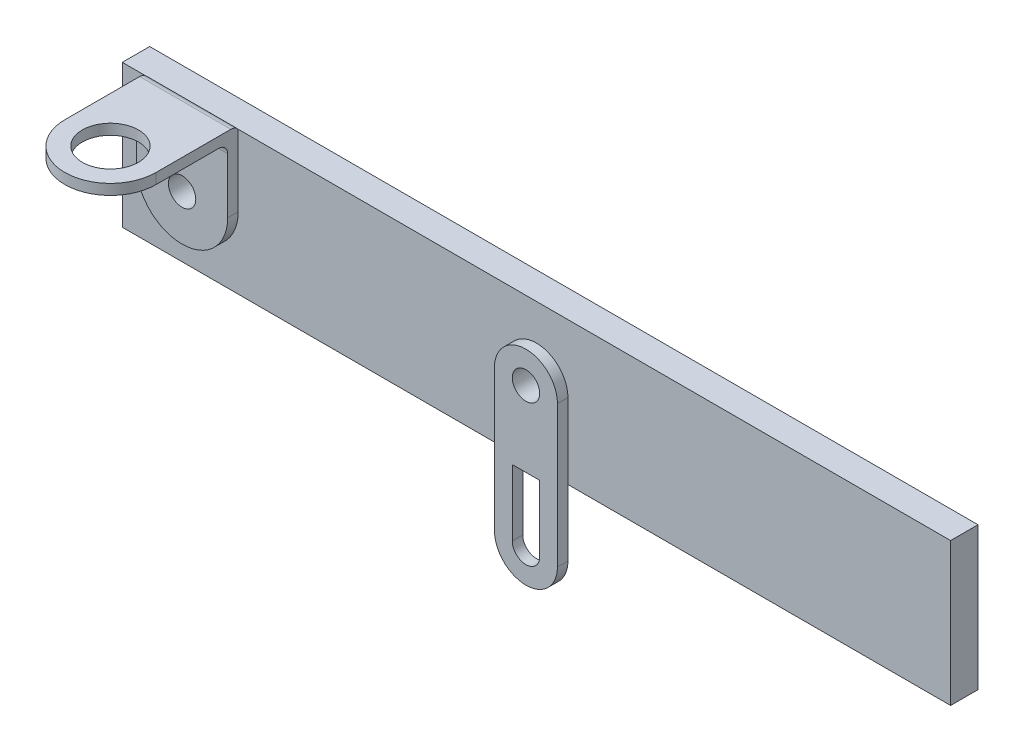
ISO-10303-21;
HEADER;
FILE_DESCRIPTION(('STEP AP214'),'2;1');
FILE_NAME('part.step','',(''),(''),'','','');
FILE_SCHEMA(('AUTOMOTIVE_DESIGN { 1 0 10303 214 1 1 1 1 }'));
ENDSEC;
DATA;
#1=APPLICATION_CONTEXT('core data for automotive mechanical design processes');
#2=APPLICATION_PROTOCOL_DEFINITION('international standard','automotive_design',2000,#1);
#3=PRODUCT_CONTEXT('',#1,'mechanical');
#4=PRODUCT('Part','Part','',(#3));
#5=PRODUCT_RELATED_PRODUCT_CATEGORY('part','',(#4));
#6=PRODUCT_DEFINITION_FORMATION('','',#4);
#7=PRODUCT_DEFINITION_CONTEXT('part definition',#1,'design');
#8=PRODUCT_DEFINITION('design','',#6,#7);
#9=PRODUCT_DEFINITION_SHAPE('','',#8);
#10=(LENGTH_UNIT() NAMED_UNIT(*) SI_UNIT(.MILLI.,.METRE.));
#11=(NAMED_UNIT(*) PLANE_ANGLE_UNIT() SI_UNIT($,.RADIAN.));
#12=(NAMED_UNIT(*) SI_UNIT($,.STERADIAN.) SOLID_ANGLE_UNIT());
#13=UNCERTAINTY_MEASURE_WITH_UNIT(LENGTH_MEASURE(1.E-05),#10,'distance_accuracy_value','');
#14=(GEOMETRIC_REPRESENTATION_CONTEXT(3) GLOBAL_UNCERTAINTY_ASSIGNED_CONTEXT((#13)) GLOBAL_UNIT_ASSIGNED_CONTEXT((#10,
#11,#12)) REPRESENTATION_CONTEXT('',''));
#15=CARTESIAN_POINT('',(0.,0.,0.));
#16=DIRECTION('',(0.,0.,1.));
#17=DIRECTION('',(1.,0.,0.));
#18=AXIS2_PLACEMENT_3D('',#15,#16,#17);
#19=CARTESIAN_POINT('',(-23.0505,0.,1.524));
#20=DIRECTION('',(0.,0.,-1.));
#21=DIRECTION('',(-1.,0.,0.));
#22=AXIS2_PLACEMENT_3D('',#19,#20,#21);
#23=PLANE('',#22);
#24=DIRECTION('',(0.,1.,0.));
#25=VECTOR('',#24,1.);
#26=CARTESIAN_POINT('',(1.7526,-3.7592,1.524));
#27=LINE('',#26,#25);
#28=CARTESIAN_POINT('',(1.7526,-7.95019999999999,1.524));
#29=VERTEX_POINT('',#28);
#30=CARTESIAN_POINT('',(1.7526,-3.7592,1.524));
#31=VERTEX_POINT('',#30);
#32=EDGE_CURVE('E226',#29,#31,#27,.T.);
#33=ORIENTED_EDGE('',*,*,#32,.F.);
#34=DIRECTION('',(1.,0.,0.));
#35=VECTOR('',#34,1.);
#36=CARTESIAN_POINT('',(23.0505,-7.95019999999999,1.524));
#37=LINE('',#36,#35);
#38=CARTESIAN_POINT('',(23.0505,-7.95019999999999,1.524));
#39=VERTEX_POINT('',#38);
#40=EDGE_CURVE('E304',#29,#39,#37,.T.);
#41=ORIENTED_EDGE('',*,*,#40,.T.);
#42=DIRECTION('',(0.,1.,0.));
#43=VECTOR('',#42,1.);
#44=CARTESIAN_POINT('',(23.0505,0.,1.524));
#45=LINE('',#44,#43);
#46=CARTESIAN_POINT('',(23.0505,0.,1.524));
#47=VERTEX_POINT('',#46);
#48=EDGE_CURVE('E308',#39,#47,#45,.T.);
#49=ORIENTED_EDGE('',*,*,#48,.T.);
#50=DIRECTION('',(-1.,0.,0.));
#51=VECTOR('',#50,1.);
#52=CARTESIAN_POINT('',(-23.0505,0.,1.524));
#53=LINE('',#52,#51);
#54=CARTESIAN_POINT('',(-16.5989,0.,1.524));
#55=VERTEX_POINT('',#54);
#56=EDGE_CURVE('E312',#47,#55,#53,.T.);
#57=ORIENTED_EDGE('',*,*,#56,.T.);
#58=DIRECTION('',(0.,1.,0.));
#59=VECTOR('',#58,1.);
#60=CARTESIAN_POINT('',(-16.5989,-3.97509999999999,1.524));
#61=LINE('',#60,#59);
#62=CARTESIAN_POINT('',(-16.5989,-3.97509999999999,1.524));
#63=VERTEX_POINT('',#62);
#64=EDGE_CURVE('E283',#63,#55,#61,.T.);
#65=ORIENTED_EDGE('',*,*,#64,.F.);
#66=CARTESIAN_POINT('',(-19.1389,-3.97509999999999,1.524));
#67=DIRECTION('',(0.,0.,1.));
#68=DIRECTION('',(1.,0.,0.));
#69=AXIS2_PLACEMENT_3D('',#66,#67,#68);
#70=CIRCLE('',#69,2.54);
#71=CARTESIAN_POINT('',(-21.6789,-3.97509999999999,1.524));
#72=VERTEX_POINT('',#71);
#73=EDGE_CURVE('E291',#72,#63,#70,.T.);
#74=ORIENTED_EDGE('',*,*,#73,.F.);
#75=DIRECTION('',(0.,-1.,0.));
#76=VECTOR('',#75,1.);
#77=CARTESIAN_POINT('',(-21.6789,-0.380999999999994,1.524));
#78=LINE('',#77,#76);
#79=CARTESIAN_POINT('',(-21.6789,0.,1.524));
#80=VERTEX_POINT('',#79);
#81=EDGE_CURVE('E279',#80,#72,#78,.T.);
#82=ORIENTED_EDGE('',*,*,#81,.F.);
#83=CARTESIAN_POINT('',(-23.0505,0.,1.524));
#84=VERTEX_POINT('',#83);
#85=EDGE_CURVE('E311',#80,#84,#53,.T.);
#86=ORIENTED_EDGE('',*,*,#85,.T.);
#87=DIRECTION('',(0.,-1.,0.));
#88=VECTOR('',#87,1.);
#89=CARTESIAN_POINT('',(-23.0505,-7.9502,1.524));
#90=LINE('',#89,#88);
#91=CARTESIAN_POINT('',(-23.0505,-7.9502,1.524));
#92=VERTEX_POINT('',#91);
#93=EDGE_CURVE('E301',#84,#92,#90,.T.);
#94=ORIENTED_EDGE('',*,*,#93,.T.);
#95=CARTESIAN_POINT('',(-1.7526,-7.95019999999999,1.524));
#96=VERTEX_POINT('',#95);
#97=EDGE_CURVE('E306',#92,#96,#37,.T.);
#98=ORIENTED_EDGE('',*,*,#97,.T.);
#99=DIRECTION('',(0.,-1.,0.));
#100=VECTOR('',#99,1.);
#101=CARTESIAN_POINT('',(-1.7526,-11.6332,1.524));
#102=LINE('',#101,#100);
#103=CARTESIAN_POINT('',(-1.7526,-3.7592,1.524));
#104=VERTEX_POINT('',#103);
#105=EDGE_CURVE('E50',#104,#96,#102,.T.);
#106=ORIENTED_EDGE('',*,*,#105,.F.);
#107=CARTESIAN_POINT('',(0.,-3.7592,1.524));
#108=DIRECTION('',(0.,0.,1.));
#109=DIRECTION('',(-1.,0.,0.));
#110=AXIS2_PLACEMENT_3D('',#107,#108,#109);
#111=CIRCLE('',#110,1.7526);
#112=EDGE_CURVE('E45',#31,#104,#111,.T.);
#113=ORIENTED_EDGE('',*,*,#112,.F.);
#114=EDGE_LOOP('',(#33,#41,#49,#57,#65,#74,#82,#86,#94,#98,#106,#113));
#115=FACE_BOUND('',#114,.T.);
#116=ADVANCED_FACE('F30',(#115),#23,.F.);
#117=CARTESIAN_POINT('',(-23.0505,-7.9502,1.524));
#118=DIRECTION('',(1.,0.,0.));
#119=DIRECTION('',(0.,0.,-1.));
#120=AXIS2_PLACEMENT_3D('',#117,#118,#119);
#121=PLANE('',#120);
#122=DIRECTION('',(0.,-1.,0.));
#123=VECTOR('',#122,1.);
#124=CARTESIAN_POINT('',(-23.0505,-7.9502,0.));
#125=LINE('',#124,#123);
#126=CARTESIAN_POINT('',(-23.0505,0.,0.));
#127=VERTEX_POINT('',#126);
#128=CARTESIAN_POINT('',(-23.0505,-7.9502,0.));
#129=VERTEX_POINT('',#128);
#130=EDGE_CURVE('E300',#127,#129,#125,.T.);
#131=ORIENTED_EDGE('',*,*,#130,.T.);
#132=DIRECTION('',(0.,0.,-1.));
#133=VECTOR('',#132,1.);
#134=CARTESIAN_POINT('',(-23.0505,-7.9502,1.524));
#135=LINE('',#134,#133);
#136=EDGE_CURVE('E331',#92,#129,#135,.T.);
#137=ORIENTED_EDGE('',*,*,#136,.F.);
#138=ORIENTED_EDGE('',*,*,#93,.F.);
#139=DIRECTION('',(0.,0.,-1.));
#140=VECTOR('',#139,1.);
#141=CARTESIAN_POINT('',(-23.0505,0.,1.524));
#142=LINE('',#141,#140);
#143=EDGE_CURVE('E315',#84,#127,#142,.T.);
#144=ORIENTED_EDGE('',*,*,#143,.T.);
#145=EDGE_LOOP('',(#131,#137,#138,#144));
#146=FACE_BOUND('',#145,.T.);
#147=ADVANCED_FACE('F403',(#146),#121,.F.);
#148=CARTESIAN_POINT('',(23.0505,-7.95019999999999,1.524));
#149=DIRECTION('',(0.,1.,0.));
#150=DIRECTION('',(-1.,0.,0.));
#151=AXIS2_PLACEMENT_3D('',#148,#149,#150);
#152=PLANE('',#151);
#153=DIRECTION('',(1.,0.,0.));
#154=VECTOR('',#153,1.);
#155=CARTESIAN_POINT('',(23.0505,-7.95019999999999,0.));
#156=LINE('',#155,#154);
#157=CARTESIAN_POINT('',(23.0505,-7.95019999999999,0.));
#158=VERTEX_POINT('',#157);
#159=EDGE_CURVE('E318',#129,#158,#156,.T.);
#160=ORIENTED_EDGE('',*,*,#159,.T.);
#161=DIRECTION('',(0.,0.,-1.));
#162=VECTOR('',#161,1.);
#163=CARTESIAN_POINT('',(23.0505,-7.95019999999999,1.524));
#164=LINE('',#163,#162);
#165=EDGE_CURVE('E328',#39,#158,#164,.T.);
#166=ORIENTED_EDGE('',*,*,#165,.F.);
#167=ORIENTED_EDGE('',*,*,#40,.F.);
#168=CARTESIAN_POINT('',(0.761999999999999,-7.95019999999999,1.524));
#169=VERTEX_POINT('',#168);
#170=EDGE_CURVE('E669',#169,#29,#37,.T.);
#171=ORIENTED_EDGE('',*,*,#170,.F.);
#172=DIRECTION('',(0.,0.,-1.));
#173=VECTOR('',#172,1.);
#174=CARTESIAN_POINT('',(0.762000000000001,-7.9502,2.1082));
#175=LINE('',#174,#173);
#176=CARTESIAN_POINT('',(0.762000000000001,-7.9502,2.1082));
#177=VERTEX_POINT('',#176);
#178=EDGE_CURVE('E177',#177,#169,#175,.T.);
#179=ORIENTED_EDGE('',*,*,#178,.F.);
#180=DIRECTION('',(-1.,0.,0.));
#181=VECTOR('',#180,1.);
#182=CARTESIAN_POINT('',(0.762000000000001,-7.9502,2.1082));
#183=LINE('',#182,#181);
#184=CARTESIAN_POINT('',(-0.761999999999999,-7.9502,2.1082));
#185=VERTEX_POINT('',#184);
#186=EDGE_CURVE('E172',#177,#185,#183,.T.);
#187=ORIENTED_EDGE('',*,*,#186,.T.);
#188=DIRECTION('',(0.,0.,-1.));
#189=VECTOR('',#188,1.);
#190=CARTESIAN_POINT('',(-0.761999999999999,-7.9502,2.1082));
#191=LINE('',#190,#189);
#192=CARTESIAN_POINT('',(-0.761999999999999,-7.9502,1.524));
#193=VERTEX_POINT('',#192);
#194=EDGE_CURVE('E175',#185,#193,#191,.T.);
#195=ORIENTED_EDGE('',*,*,#194,.T.);
#196=EDGE_CURVE('E309',#96,#193,#37,.T.);
#197=ORIENTED_EDGE('',*,*,#196,.F.);
#198=ORIENTED_EDGE('',*,*,#97,.F.);
#199=ORIENTED_EDGE('',*,*,#136,.T.);
#200=EDGE_LOOP('',(#160,#166,#167,#171,#179,#187,#195,#197,#198,#199));
#201=FACE_BOUND('',#200,.T.);
#202=ADVANCED_FACE('F174',(#201),#152,.F.);
#203=CARTESIAN_POINT('',(23.0505,0.,1.524));
#204=DIRECTION('',(-1.,0.,0.));
#205=DIRECTION('',(0.,0.,1.));
#206=AXIS2_PLACEMENT_3D('',#203,#204,#205);
#207=PLANE('',#206);
#208=DIRECTION('',(0.,1.,0.));
#209=VECTOR('',#208,1.);
#210=CARTESIAN_POINT('',(23.0505,0.,0.));
#211=LINE('',#210,#209);
#212=CARTESIAN_POINT('',(23.0505,0.,0.));
#213=VERTEX_POINT('',#212);
#214=EDGE_CURVE('E320',#158,#213,#211,.T.);
#215=ORIENTED_EDGE('',*,*,#214,.T.);
#216=DIRECTION('',(0.,0.,-1.));
#217=VECTOR('',#216,1.);
#218=CARTESIAN_POINT('',(23.0505,0.,1.524));
#219=LINE('',#218,#217);
#220=EDGE_CURVE('E325',#47,#213,#219,.T.);
#221=ORIENTED_EDGE('',*,*,#220,.F.);
#222=ORIENTED_EDGE('',*,*,#48,.F.);
#223=ORIENTED_EDGE('',*,*,#165,.T.);
#224=EDGE_LOOP('',(#215,#221,#222,#223));
#225=FACE_BOUND('',#224,.T.);
#226=ADVANCED_FACE('F419',(#225),#207,.F.);
#227=CARTESIAN_POINT('',(-23.0505,0.,1.524));
#228=DIRECTION('',(0.,-1.,0.));
#229=DIRECTION('',(1.,0.,0.));
#230=AXIS2_PLACEMENT_3D('',#227,#228,#229);
#231=PLANE('',#230);
#232=DIRECTION('',(-1.,0.,0.));
#233=VECTOR('',#232,1.);
#234=CARTESIAN_POINT('',(-23.0505,0.,0.));
#235=LINE('',#234,#233);
#236=EDGE_CURVE('E305',#213,#127,#235,.T.);
#237=ORIENTED_EDGE('',*,*,#236,.T.);
#238=ORIENTED_EDGE('',*,*,#143,.F.);
#239=ORIENTED_EDGE('',*,*,#85,.F.);
#240=DIRECTION('',(-1.,0.,0.));
#241=VECTOR('',#240,1.);
#242=CARTESIAN_POINT('',(-23.0505,0.,1.524));
#243=LINE('',#242,#241);
#244=EDGE_CURVE('E276',#55,#80,#243,.T.);
#245=ORIENTED_EDGE('',*,*,#244,.F.);
#246=ORIENTED_EDGE('',*,*,#56,.F.);
#247=ORIENTED_EDGE('',*,*,#220,.T.);
#248=EDGE_LOOP('',(#237,#238,#239,#245,#246,#247));
#249=FACE_BOUND('',#248,.T.);
#250=ADVANCED_FACE('F377',(#249),#231,.F.);
#251=CARTESIAN_POINT('',(-23.0505,0.,0.));
#252=DIRECTION('',(0.,0.,-1.));
#253=DIRECTION('',(-1.,0.,0.));
#254=AXIS2_PLACEMENT_3D('',#251,#252,#253);
#255=PLANE('',#254);
#256=CARTESIAN_POINT('',(0.,-3.7592,0.));
#257=DIRECTION('',(0.,0.,1.));
#258=DIRECTION('',(1.,0.,0.));
#259=AXIS2_PLACEMENT_3D('',#256,#257,#258);
#260=CIRCLE('',#259,0.762000000000001);
#261=CARTESIAN_POINT('',(0.762000000000001,-3.7592,0.));
#262=VERTEX_POINT('',#261);
#263=EDGE_CURVE('E205',#262,#262,#260,.T.);
#264=ORIENTED_EDGE('',*,*,#263,.T.);
#265=EDGE_LOOP('',(#264));
#266=FACE_BOUND('',#265,.T.);
#267=CARTESIAN_POINT('',(-19.1389,-3.97509999999999,0.));
#268=DIRECTION('',(0.,0.,1.));
#269=DIRECTION('',(1.,0.,0.));
#270=AXIS2_PLACEMENT_3D('',#267,#268,#269);
#271=CIRCLE('',#270,0.761999999999999);
#272=CARTESIAN_POINT('',(-18.3769,-3.97509999999999,0.));
#273=VERTEX_POINT('',#272);
#274=EDGE_CURVE('E245',#273,#273,#271,.T.);
#275=ORIENTED_EDGE('',*,*,#274,.T.);
#276=EDGE_LOOP('',(#275));
#277=FACE_BOUND('',#276,.T.);
#278=ORIENTED_EDGE('',*,*,#130,.F.);
#279=ORIENTED_EDGE('',*,*,#236,.F.);
#280=ORIENTED_EDGE('',*,*,#214,.F.);
#281=ORIENTED_EDGE('',*,*,#159,.F.);
#282=EDGE_LOOP('',(#278,#279,#280,#281));
#283=FACE_BOUND('',#282,.T.);
#284=ADVANCED_FACE('F413',(#266,#277,#283),#255,.T.);
#285=CARTESIAN_POINT('',(-21.6789,-0.380999999999994,2.1082));
#286=DIRECTION('',(1.,0.,0.));
#287=DIRECTION('',(0.,1.,0.));
#288=AXIS2_PLACEMENT_3D('',#285,#286,#287);
#289=PLANE('',#288);
#290=DIRECTION('',(0.,0.,1.));
#291=VECTOR('',#290,1.);
#292=CARTESIAN_POINT('',(-21.6789,0.203200000000006,1.524));
#293=LINE('',#292,#291);
#294=CARTESIAN_POINT('',(-21.6789,0.203200000000006,1.9304));
#295=VERTEX_POINT('',#294);
#296=CARTESIAN_POINT('',(-21.6789,0.203200000000006,6.096));
#297=VERTEX_POINT('',#296);
#298=EDGE_CURVE('E260',#295,#297,#293,.T.);
#299=ORIENTED_EDGE('',*,*,#298,.F.);
#300=CARTESIAN_POINT('',(-21.6789,-0.304799999999994,1.9304));
#301=DIRECTION('',(1.,0.,0.));
#302=DIRECTION('',(0.,1.,0.));
#303=AXIS2_PLACEMENT_3D('',#300,#301,#302);
#304=CIRCLE('',#303,0.508);
#305=EDGE_CURVE('E342',#295,#80,#304,.F.);
#306=ORIENTED_EDGE('',*,*,#305,.T.);
#307=ORIENTED_EDGE('',*,*,#81,.T.);
#308=DIRECTION('',(0.,0.,-1.));
#309=VECTOR('',#308,1.);
#310=CARTESIAN_POINT('',(-21.6789,-3.97509999999999,2.1082));
#311=LINE('',#310,#309);
#312=CARTESIAN_POINT('',(-21.6789,-3.97509999999999,2.1082));
#313=VERTEX_POINT('',#312);
#314=EDGE_CURVE('E297',#313,#72,#311,.T.);
#315=ORIENTED_EDGE('',*,*,#314,.F.);
#316=DIRECTION('',(0.,-1.,0.));
#317=VECTOR('',#316,1.);
#318=CARTESIAN_POINT('',(-21.6789,-0.380999999999994,2.1082));
#319=LINE('',#318,#317);
#320=CARTESIAN_POINT('',(-21.6789,-0.888999999999994,2.1082));
#321=VERTEX_POINT('',#320);
#322=EDGE_CURVE('E280',#321,#313,#319,.T.);
#323=ORIENTED_EDGE('',*,*,#322,.F.);
#324=CARTESIAN_POINT('',(-21.6789,-0.888999999999994,2.6162));
#325=DIRECTION('',(1.,0.,0.));
#326=DIRECTION('',(0.,1.,0.));
#327=AXIS2_PLACEMENT_3D('',#324,#325,#326);
#328=CIRCLE('',#327,0.508);
#329=CARTESIAN_POINT('',(-21.6789,-0.380999999999994,2.6162));
#330=VERTEX_POINT('',#329);
#331=EDGE_CURVE('E38',#321,#330,#328,.T.);
#332=ORIENTED_EDGE('',*,*,#331,.T.);
#333=DIRECTION('',(0.,0.,1.));
#334=VECTOR('',#333,1.);
#335=CARTESIAN_POINT('',(-21.6789,-0.380999999999994,1.524));
#336=LINE('',#335,#334);
#337=CARTESIAN_POINT('',(-21.6789,-0.380999999999994,6.096));
#338=VERTEX_POINT('',#337);
#339=EDGE_CURVE('E268',#330,#338,#336,.T.);
#340=ORIENTED_EDGE('',*,*,#339,.T.);
#341=DIRECTION('',(0.,-1.,0.));
#342=VECTOR('',#341,1.);
#343=CARTESIAN_POINT('',(-21.6789,0.203200000000006,6.096));
#344=LINE('',#343,#342);
#345=EDGE_CURVE('E273',#297,#338,#344,.T.);
#346=ORIENTED_EDGE('',*,*,#345,.F.);
#347=EDGE_LOOP('',(#299,#306,#307,#315,#323,#332,#340,#346));
#348=FACE_BOUND('',#347,.T.);
#349=ADVANCED_FACE('F349',(#348),#289,.F.);
#350=CARTESIAN_POINT('',(-19.1389,-3.97509999999999,2.1082));
#351=DIRECTION('',(0.,0.,-1.));
#352=DIRECTION('',(-1.,0.,0.));
#353=AXIS2_PLACEMENT_3D('',#350,#351,#352);
#354=CYLINDRICAL_SURFACE('',#353,2.54);
#355=ORIENTED_EDGE('',*,*,#73,.T.);
#356=DIRECTION('',(0.,0.,-1.));
#357=VECTOR('',#356,1.);
#358=CARTESIAN_POINT('',(-16.5989,-3.97509999999999,2.1082));
#359=LINE('',#358,#357);
#360=CARTESIAN_POINT('',(-16.5989,-3.97509999999999,2.1082));
#361=VERTEX_POINT('',#360);
#362=EDGE_CURVE('E288',#361,#63,#359,.T.);
#363=ORIENTED_EDGE('',*,*,#362,.F.);
#364=CARTESIAN_POINT('',(-19.1389,-3.97509999999999,2.1082));
#365=DIRECTION('',(0.,0.,1.));
#366=DIRECTION('',(1.,0.,0.));
#367=AXIS2_PLACEMENT_3D('',#364,#365,#366);
#368=CIRCLE('',#367,2.54);
#369=EDGE_CURVE('E282',#313,#361,#368,.T.);
#370=ORIENTED_EDGE('',*,*,#369,.F.);
#371=ORIENTED_EDGE('',*,*,#314,.T.);
#372=EDGE_LOOP('',(#355,#363,#370,#371));
#373=FACE_BOUND('',#372,.T.);
#374=ADVANCED_FACE('F370',(#373),#354,.T.);
#375=CARTESIAN_POINT('',(-16.5989,-3.97509999999999,2.1082));
#376=DIRECTION('',(-1.,0.,0.));
#377=DIRECTION('',(0.,0.,1.));
#378=AXIS2_PLACEMENT_3D('',#375,#376,#377);
#379=PLANE('',#378);
#380=ORIENTED_EDGE('',*,*,#64,.T.);
#381=CARTESIAN_POINT('',(-16.5989,-0.304799999999993,1.9304));
#382=DIRECTION('',(-1.,0.,0.));
#383=DIRECTION('',(0.,0.,1.));
#384=AXIS2_PLACEMENT_3D('',#381,#382,#383);
#385=CIRCLE('',#384,0.508);
#386=CARTESIAN_POINT('',(-16.5989,0.203200000000007,1.9304));
#387=VERTEX_POINT('',#386);
#388=EDGE_CURVE('E344',#55,#387,#385,.F.);
#389=ORIENTED_EDGE('',*,*,#388,.T.);
#390=DIRECTION('',(0.,0.,-1.));
#391=VECTOR('',#390,1.);
#392=CARTESIAN_POINT('',(-16.5989,0.203200000000007,6.096));
#393=LINE('',#392,#391);
#394=CARTESIAN_POINT('',(-16.5989,0.203200000000007,6.096));
#395=VERTEX_POINT('',#394);
#396=EDGE_CURVE('E257',#395,#387,#393,.T.);
#397=ORIENTED_EDGE('',*,*,#396,.F.);
#398=DIRECTION('',(0.,-1.,0.));
#399=VECTOR('',#398,1.);
#400=CARTESIAN_POINT('',(-16.5989,0.203200000000007,6.096));
#401=LINE('',#400,#399);
#402=CARTESIAN_POINT('',(-16.5989,-0.380999999999993,6.096));
#403=VERTEX_POINT('',#402);
#404=EDGE_CURVE('E265',#395,#403,#401,.T.);
#405=ORIENTED_EDGE('',*,*,#404,.T.);
#406=DIRECTION('',(0.,0.,-1.));
#407=VECTOR('',#406,1.);
#408=CARTESIAN_POINT('',(-16.5989,-0.380999999999993,6.096));
#409=LINE('',#408,#407);
#410=CARTESIAN_POINT('',(-16.5989,-0.380999999999993,2.6162));
#411=VERTEX_POINT('',#410);
#412=EDGE_CURVE('E254',#403,#411,#409,.T.);
#413=ORIENTED_EDGE('',*,*,#412,.T.);
#414=CARTESIAN_POINT('',(-16.5989,-0.888999999999993,2.6162));
#415=DIRECTION('',(-1.,0.,0.));
#416=DIRECTION('',(0.,0.,1.));
#417=AXIS2_PLACEMENT_3D('',#414,#415,#416);
#418=CIRCLE('',#417,0.508);
#419=CARTESIAN_POINT('',(-16.5989,-0.888999999999993,2.1082));
#420=VERTEX_POINT('',#419);
#421=EDGE_CURVE('E11',#411,#420,#418,.T.);
#422=ORIENTED_EDGE('',*,*,#421,.T.);
#423=DIRECTION('',(0.,1.,0.));
#424=VECTOR('',#423,1.);
#425=CARTESIAN_POINT('',(-16.5989,-3.97509999999999,2.1082));
#426=LINE('',#425,#424);
#427=EDGE_CURVE('E285',#361,#420,#426,.T.);
#428=ORIENTED_EDGE('',*,*,#427,.F.);
#429=ORIENTED_EDGE('',*,*,#362,.T.);
#430=EDGE_LOOP('',(#380,#389,#397,#405,#413,#422,#428,#429));
#431=FACE_BOUND('',#430,.T.);
#432=ADVANCED_FACE('F364',(#431),#379,.F.);
#433=CARTESIAN_POINT('',(-19.1389,-3.97509999999999,2.1082));
#434=DIRECTION('',(0.,0.,1.));
#435=DIRECTION('',(1.,0.,0.));
#436=AXIS2_PLACEMENT_3D('',#433,#434,#435);
#437=PLANE('',#436);
#438=CARTESIAN_POINT('',(-19.1389,-3.97509999999999,2.1082));
#439=DIRECTION('',(0.,0.,1.));
#440=DIRECTION('',(1.,0.,0.));
#441=AXIS2_PLACEMENT_3D('',#438,#439,#440);
#442=CIRCLE('',#441,0.761999999999999);
#443=CARTESIAN_POINT('',(-18.3769,-3.97509999999999,2.1082));
#444=VERTEX_POINT('',#443);
#445=EDGE_CURVE('E244',#444,#444,#442,.T.);
#446=ORIENTED_EDGE('',*,*,#445,.F.);
#447=EDGE_LOOP('',(#446));
#448=FACE_BOUND('',#447,.T.);
#449=ORIENTED_EDGE('',*,*,#427,.T.);
#450=DIRECTION('',(-1.,0.,0.));
#451=VECTOR('',#450,1.);
#452=CARTESIAN_POINT('',(-19.1389,-0.888999999999994,2.1082));
#453=LINE('',#452,#451);
#454=EDGE_CURVE('E334',#420,#321,#453,.T.);
#455=ORIENTED_EDGE('',*,*,#454,.T.);
#456=ORIENTED_EDGE('',*,*,#322,.T.);
#457=ORIENTED_EDGE('',*,*,#369,.T.);
#458=EDGE_LOOP('',(#449,#455,#456,#457));
#459=FACE_BOUND('',#458,.T.);
#460=ADVANCED_FACE('F366',(#448,#459),#437,.T.);
#461=CARTESIAN_POINT('',(-19.1389,0.203200000000007,6.096));
#462=DIRECTION('',(0.,1.,0.));
#463=DIRECTION('',(-1.,0.,0.));
#464=AXIS2_PLACEMENT_3D('',#461,#462,#463);
#465=PLANE('',#464);
#466=ORIENTED_EDGE('',*,*,#396,.T.);
#467=DIRECTION('',(-1.,0.,0.));
#468=VECTOR('',#467,1.);
#469=CARTESIAN_POINT('',(-21.6789,0.203200000000006,1.9304));
#470=LINE('',#469,#468);
#471=EDGE_CURVE('E339',#387,#295,#470,.T.);
#472=ORIENTED_EDGE('',*,*,#471,.T.);
#473=ORIENTED_EDGE('',*,*,#298,.T.);
#474=CARTESIAN_POINT('',(-19.1389,0.203200000000007,6.096));
#475=DIRECTION('',(0.,1.,0.));
#476=DIRECTION('',(-1.,0.,0.));
#477=AXIS2_PLACEMENT_3D('',#474,#475,#476);
#478=CIRCLE('',#477,2.54);
#479=EDGE_CURVE('E263',#297,#395,#478,.T.);
#480=ORIENTED_EDGE('',*,*,#479,.T.);
#481=EDGE_LOOP('',(#466,#472,#473,#480));
#482=FACE_BOUND('',#481,.T.);
#483=CARTESIAN_POINT('',(-19.1389,0.203200000000007,6.096));
#484=DIRECTION('',(0.,1.,0.));
#485=DIRECTION('',(-1.,0.,0.));
#486=AXIS2_PLACEMENT_3D('',#483,#484,#485);
#487=CIRCLE('',#486,1.5621);
#488=CARTESIAN_POINT('',(-20.701,0.203200000000006,6.096));
#489=VERTEX_POINT('',#488);
#490=EDGE_CURVE('E251',#489,#489,#487,.T.);
#491=ORIENTED_EDGE('',*,*,#490,.F.);
#492=EDGE_LOOP('',(#491));
#493=FACE_BOUND('',#492,.T.);
#494=ADVANCED_FACE('F384',(#482,#493),#465,.T.);
#495=CARTESIAN_POINT('',(-19.1389,-0.380999999999993,6.096));
#496=DIRECTION('',(0.,1.,0.));
#497=DIRECTION('',(-1.,0.,0.));
#498=AXIS2_PLACEMENT_3D('',#495,#496,#497);
#499=PLANE('',#498);
#500=ORIENTED_EDGE('',*,*,#339,.F.);
#501=DIRECTION('',(-1.,0.,0.));
#502=VECTOR('',#501,1.);
#503=CARTESIAN_POINT('',(-19.1389,-0.380999999999993,2.6162));
#504=LINE('',#503,#502);
#505=EDGE_CURVE('E337',#330,#411,#504,.F.);
#506=ORIENTED_EDGE('',*,*,#505,.T.);
#507=ORIENTED_EDGE('',*,*,#412,.F.);
#508=CARTESIAN_POINT('',(-19.1389,-0.380999999999993,6.096));
#509=DIRECTION('',(0.,1.,0.));
#510=DIRECTION('',(-1.,0.,0.));
#511=AXIS2_PLACEMENT_3D('',#508,#509,#510);
#512=CIRCLE('',#511,2.54);
#513=EDGE_CURVE('E261',#338,#403,#512,.T.);
#514=ORIENTED_EDGE('',*,*,#513,.F.);
#515=EDGE_LOOP('',(#500,#506,#507,#514));
#516=FACE_BOUND('',#515,.T.);
#517=CARTESIAN_POINT('',(-19.1389,-0.380999999999993,6.096));
#518=DIRECTION('',(0.,1.,0.));
#519=DIRECTION('',(-1.,0.,0.));
#520=AXIS2_PLACEMENT_3D('',#517,#518,#519);
#521=CIRCLE('',#520,1.5621);
#522=CARTESIAN_POINT('',(-20.701,-0.380999999999994,6.096));
#523=VERTEX_POINT('',#522);
#524=EDGE_CURVE('E248',#523,#523,#521,.T.);
#525=ORIENTED_EDGE('',*,*,#524,.T.);
#526=EDGE_LOOP('',(#525));
#527=FACE_BOUND('',#526,.T.);
#528=ADVANCED_FACE('F357',(#516,#527),#499,.F.);
#529=CARTESIAN_POINT('',(-19.1389,0.203200000000007,6.096));
#530=DIRECTION('',(0.,-1.,0.));
#531=DIRECTION('',(1.,0.,0.));
#532=AXIS2_PLACEMENT_3D('',#529,#530,#531);
#533=CYLINDRICAL_SURFACE('',#532,2.54);
#534=ORIENTED_EDGE('',*,*,#513,.T.);
#535=ORIENTED_EDGE('',*,*,#404,.F.);
#536=ORIENTED_EDGE('',*,*,#479,.F.);
#537=ORIENTED_EDGE('',*,*,#345,.T.);
#538=EDGE_LOOP('',(#534,#535,#536,#537));
#539=FACE_BOUND('',#538,.T.);
#540=ADVANCED_FACE('F390',(#539),#533,.T.);
#541=CARTESIAN_POINT('',(-19.1389,0.203200000000007,6.096));
#542=DIRECTION('',(0.,-1.,0.));
#543=DIRECTION('',(1.,0.,0.));
#544=AXIS2_PLACEMENT_3D('',#541,#542,#543);
#545=CYLINDRICAL_SURFACE('',#544,1.5621);
#546=ORIENTED_EDGE('',*,*,#490,.T.);
#547=EDGE_LOOP('',(#546));
#548=FACE_BOUND('',#547,.T.);
#549=ORIENTED_EDGE('',*,*,#524,.F.);
#550=EDGE_LOOP('',(#549));
#551=FACE_BOUND('',#550,.T.);
#552=ADVANCED_FACE('F392',(#548,#551),#545,.F.);
#553=CARTESIAN_POINT('',(-19.1389,-0.888999999999994,2.6162));
#554=DIRECTION('',(-1.,0.,0.));
#555=DIRECTION('',(0.,-1.,0.));
#556=AXIS2_PLACEMENT_3D('',#553,#554,#555);
#557=CYLINDRICAL_SURFACE('',#556,0.508);
#558=ORIENTED_EDGE('',*,*,#421,.F.);
#559=ORIENTED_EDGE('',*,*,#505,.F.);
#560=ORIENTED_EDGE('',*,*,#331,.F.);
#561=ORIENTED_EDGE('',*,*,#454,.F.);
#562=EDGE_LOOP('',(#558,#559,#560,#561));
#563=FACE_BOUND('',#562,.T.);
#564=ADVANCED_FACE('F361',(#563),#557,.F.);
#565=CARTESIAN_POINT('',(-16.5989,-0.304799999999993,1.9304));
#566=DIRECTION('',(1.,0.,0.));
#567=DIRECTION('',(0.,1.,0.));
#568=AXIS2_PLACEMENT_3D('',#565,#566,#567);
#569=CYLINDRICAL_SURFACE('',#568,0.508);
#570=ORIENTED_EDGE('',*,*,#388,.F.);
#571=ORIENTED_EDGE('',*,*,#244,.T.);
#572=ORIENTED_EDGE('',*,*,#305,.F.);
#573=ORIENTED_EDGE('',*,*,#471,.F.);
#574=EDGE_LOOP('',(#570,#571,#572,#573));
#575=FACE_BOUND('',#574,.T.);
#576=ADVANCED_FACE('F32',(#575),#569,.T.);
#577=CARTESIAN_POINT('',(-19.1389,-3.97509999999999,0.));
#578=DIRECTION('',(0.,0.,1.));
#579=DIRECTION('',(1.,0.,0.));
#580=AXIS2_PLACEMENT_3D('',#577,#578,#579);
#581=CYLINDRICAL_SURFACE('',#580,0.761999999999999);
#582=ORIENTED_EDGE('',*,*,#274,.F.);
#583=EDGE_LOOP('',(#582));
#584=FACE_BOUND('',#583,.T.);
#585=ORIENTED_EDGE('',*,*,#445,.T.);
#586=EDGE_LOOP('',(#585));
#587=FACE_BOUND('',#586,.T.);
#588=ADVANCED_FACE('F428',(#584,#587),#581,.F.);
#589=CARTESIAN_POINT('',(0.,-11.6332,1.524));
#590=DIRECTION('',(0.,0.,-1.));
#591=DIRECTION('',(-1.,0.,0.));
#592=AXIS2_PLACEMENT_3D('',#589,#590,#591);
#593=PLANE('',#592);
#594=ORIENTED_EDGE('',*,*,#170,.T.);
#595=CARTESIAN_POINT('',(1.7526,-11.6332,1.524));
#596=VERTEX_POINT('',#595);
#597=EDGE_CURVE('E227',#596,#29,#27,.T.);
#598=ORIENTED_EDGE('',*,*,#597,.F.);
#599=CARTESIAN_POINT('',(0.,-11.6332,1.524));
#600=DIRECTION('',(0.,0.,1.));
#601=DIRECTION('',(-1.,0.,0.));
#602=AXIS2_PLACEMENT_3D('',#599,#600,#601);
#603=CIRCLE('',#602,1.7526);
#604=CARTESIAN_POINT('',(-1.7526,-11.6332,1.524));
#605=VERTEX_POINT('',#604);
#606=EDGE_CURVE('E190',#605,#596,#603,.T.);
#607=ORIENTED_EDGE('',*,*,#606,.F.);
#608=EDGE_CURVE('E231',#96,#605,#102,.T.);
#609=ORIENTED_EDGE('',*,*,#608,.F.);
#610=ORIENTED_EDGE('',*,*,#196,.T.);
#611=DIRECTION('',(0.,-1.,0.));
#612=VECTOR('',#611,1.);
#613=CARTESIAN_POINT('',(-0.761999999999999,-7.9502,1.524));
#614=LINE('',#613,#612);
#615=CARTESIAN_POINT('',(-0.761999999999999,-11.6332,1.524));
#616=VERTEX_POINT('',#615);
#617=EDGE_CURVE('E189',#193,#616,#614,.T.);
#618=ORIENTED_EDGE('',*,*,#617,.T.);
#619=CARTESIAN_POINT('',(0.,-11.6332,1.524));
#620=DIRECTION('',(0.,0.,1.));
#621=DIRECTION('',(1.,0.,0.));
#622=AXIS2_PLACEMENT_3D('',#619,#620,#621);
#623=CIRCLE('',#622,0.762);
#624=CARTESIAN_POINT('',(0.762,-11.6332,1.524));
#625=VERTEX_POINT('',#624);
#626=EDGE_CURVE('E204',#616,#625,#623,.T.);
#627=ORIENTED_EDGE('',*,*,#626,.T.);
#628=DIRECTION('',(0.,1.,0.));
#629=VECTOR('',#628,1.);
#630=CARTESIAN_POINT('',(0.762000000000001,-11.6332,1.524));
#631=LINE('',#630,#629);
#632=EDGE_CURVE('E182',#625,#169,#631,.T.);
#633=ORIENTED_EDGE('',*,*,#632,.T.);
#634=EDGE_LOOP('',(#594,#598,#607,#609,#610,#618,#627,#633));
#635=FACE_BOUND('',#634,.T.);
#636=ADVANCED_FACE('F432',(#635),#593,.T.);
#637=CARTESIAN_POINT('',(0.,-11.6332,2.1082));
#638=DIRECTION('',(0.,0.,-1.));
#639=DIRECTION('',(-1.,0.,0.));
#640=AXIS2_PLACEMENT_3D('',#637,#638,#639);
#641=PLANE('',#640);
#642=CARTESIAN_POINT('',(0.,-3.7592,2.1082));
#643=DIRECTION('',(0.,0.,1.));
#644=DIRECTION('',(1.,0.,0.));
#645=AXIS2_PLACEMENT_3D('',#642,#643,#644);
#646=CIRCLE('',#645,0.762000000000001);
#647=CARTESIAN_POINT('',(0.762000000000001,-3.7592,2.1082));
#648=VERTEX_POINT('',#647);
#649=EDGE_CURVE('E650',#648,#648,#646,.T.);
#650=ORIENTED_EDGE('',*,*,#649,.F.);
#651=EDGE_LOOP('',(#650));
#652=FACE_BOUND('',#651,.T.);
#653=CARTESIAN_POINT('',(0.,-11.6332,2.1082));
#654=DIRECTION('',(0.,0.,1.));
#655=DIRECTION('',(-1.,0.,0.));
#656=AXIS2_PLACEMENT_3D('',#653,#654,#655);
#657=CIRCLE('',#656,1.7526);
#658=CARTESIAN_POINT('',(-1.7526,-11.6332,2.1082));
#659=VERTEX_POINT('',#658);
#660=CARTESIAN_POINT('',(1.7526,-11.6332,2.1082));
#661=VERTEX_POINT('',#660);
#662=EDGE_CURVE('E214',#659,#661,#657,.T.);
#663=ORIENTED_EDGE('',*,*,#662,.T.);
#664=DIRECTION('',(0.,1.,0.));
#665=VECTOR('',#664,1.);
#666=CARTESIAN_POINT('',(1.7526,-3.7592,2.1082));
#667=LINE('',#666,#665);
#668=CARTESIAN_POINT('',(1.7526,-3.7592,2.1082));
#669=VERTEX_POINT('',#668);
#670=EDGE_CURVE('E217',#661,#669,#667,.T.);
#671=ORIENTED_EDGE('',*,*,#670,.T.);
#672=CARTESIAN_POINT('',(0.,-3.7592,2.1082));
#673=DIRECTION('',(0.,0.,1.));
#674=DIRECTION('',(-1.,0.,0.));
#675=AXIS2_PLACEMENT_3D('',#672,#673,#674);
#676=CIRCLE('',#675,1.7526);
#677=CARTESIAN_POINT('',(-1.7526,-3.7592,2.1082));
#678=VERTEX_POINT('',#677);
#679=EDGE_CURVE('E219',#669,#678,#676,.T.);
#680=ORIENTED_EDGE('',*,*,#679,.T.);
#681=DIRECTION('',(0.,-1.,0.));
#682=VECTOR('',#681,1.);
#683=CARTESIAN_POINT('',(-1.7526,-11.6332,2.1082));
#684=LINE('',#683,#682);
#685=EDGE_CURVE('E221',#678,#659,#684,.T.);
#686=ORIENTED_EDGE('',*,*,#685,.T.);
#687=EDGE_LOOP('',(#663,#671,#680,#686));
#688=FACE_BOUND('',#687,.T.);
#689=ORIENTED_EDGE('',*,*,#186,.F.);
#690=DIRECTION('',(0.,1.,0.));
#691=VECTOR('',#690,1.);
#692=CARTESIAN_POINT('',(0.762000000000001,-11.6332,2.1082));
#693=LINE('',#692,#691);
#694=CARTESIAN_POINT('',(0.762000000000001,-11.6332,2.1082));
#695=VERTEX_POINT('',#694);
#696=EDGE_CURVE('E198',#695,#177,#693,.T.);
#697=ORIENTED_EDGE('',*,*,#696,.F.);
#698=CARTESIAN_POINT('',(0.,-11.6332,2.1082));
#699=DIRECTION('',(0.,0.,1.));
#700=DIRECTION('',(1.,0.,0.));
#701=AXIS2_PLACEMENT_3D('',#698,#699,#700);
#702=CIRCLE('',#701,0.762);
#703=CARTESIAN_POINT('',(-0.761999999999999,-11.6332,2.1082));
#704=VERTEX_POINT('',#703);
#705=EDGE_CURVE('E196',#704,#695,#702,.T.);
#706=ORIENTED_EDGE('',*,*,#705,.F.);
#707=DIRECTION('',(0.,-1.,0.));
#708=VECTOR('',#707,1.);
#709=CARTESIAN_POINT('',(-0.761999999999999,-7.9502,2.1082));
#710=LINE('',#709,#708);
#711=EDGE_CURVE('E181',#185,#704,#710,.T.);
#712=ORIENTED_EDGE('',*,*,#711,.F.);
#713=EDGE_LOOP('',(#689,#697,#706,#712));
#714=FACE_BOUND('',#713,.T.);
#715=ADVANCED_FACE('F194',(#652,#688,#714),#641,.F.);
#716=CARTESIAN_POINT('',(0.,-11.6332,2.1082));
#717=DIRECTION('',(0.,0.,-1.));
#718=DIRECTION('',(-1.,0.,0.));
#719=AXIS2_PLACEMENT_3D('',#716,#717,#718);
#720=CYLINDRICAL_SURFACE('',#719,1.7526);
#721=ORIENTED_EDGE('',*,*,#606,.T.);
#722=DIRECTION('',(0.,0.,-1.));
#723=VECTOR('',#722,1.);
#724=CARTESIAN_POINT('',(1.7526,-11.6332,2.1082));
#725=LINE('',#724,#723);
#726=EDGE_CURVE('E241',#661,#596,#725,.T.);
#727=ORIENTED_EDGE('',*,*,#726,.F.);
#728=ORIENTED_EDGE('',*,*,#662,.F.);
#729=DIRECTION('',(0.,0.,-1.));
#730=VECTOR('',#729,1.);
#731=CARTESIAN_POINT('',(-1.7526,-11.6332,2.1082));
#732=LINE('',#731,#730);
#733=EDGE_CURVE('E223',#659,#605,#732,.T.);
#734=ORIENTED_EDGE('',*,*,#733,.T.);
#735=EDGE_LOOP('',(#721,#727,#728,#734));
#736=FACE_BOUND('',#735,.T.);
#737=ADVANCED_FACE('F443',(#736),#720,.T.);
#738=CARTESIAN_POINT('',(1.7526,-3.7592,2.1082));
#739=DIRECTION('',(-1.,0.,0.));
#740=DIRECTION('',(0.,0.,1.));
#741=AXIS2_PLACEMENT_3D('',#738,#739,#740);
#742=PLANE('',#741);
#743=ORIENTED_EDGE('',*,*,#597,.T.);
#744=ORIENTED_EDGE('',*,*,#32,.T.);
#745=DIRECTION('',(0.,0.,-1.));
#746=VECTOR('',#745,1.);
#747=CARTESIAN_POINT('',(1.7526,-3.7592,2.1082));
#748=LINE('',#747,#746);
#749=EDGE_CURVE('E238',#669,#31,#748,.T.);
#750=ORIENTED_EDGE('',*,*,#749,.F.);
#751=ORIENTED_EDGE('',*,*,#670,.F.);
#752=ORIENTED_EDGE('',*,*,#726,.T.);
#753=EDGE_LOOP('',(#743,#744,#750,#751,#752));
#754=FACE_BOUND('',#753,.T.);
#755=ADVANCED_FACE('F576',(#754),#742,.F.);
#756=CARTESIAN_POINT('',(0.,-3.7592,2.1082));
#757=DIRECTION('',(0.,0.,-1.));
#758=DIRECTION('',(-1.,0.,0.));
#759=AXIS2_PLACEMENT_3D('',#756,#757,#758);
#760=CYLINDRICAL_SURFACE('',#759,1.7526);
#761=ORIENTED_EDGE('',*,*,#112,.T.);
#762=DIRECTION('',(0.,0.,-1.));
#763=VECTOR('',#762,1.);
#764=CARTESIAN_POINT('',(-1.7526,-3.7592,2.1082));
#765=LINE('',#764,#763);
#766=EDGE_CURVE('E235',#678,#104,#765,.T.);
#767=ORIENTED_EDGE('',*,*,#766,.F.);
#768=ORIENTED_EDGE('',*,*,#679,.F.);
#769=ORIENTED_EDGE('',*,*,#749,.T.);
#770=EDGE_LOOP('',(#761,#767,#768,#769));
#771=FACE_BOUND('',#770,.T.);
#772=ADVANCED_FACE('F584',(#771),#760,.T.);
#773=CARTESIAN_POINT('',(-1.7526,-11.6332,2.1082));
#774=DIRECTION('',(1.,0.,0.));
#775=DIRECTION('',(0.,1.,0.));
#776=AXIS2_PLACEMENT_3D('',#773,#774,#775);
#777=PLANE('',#776);
#778=ORIENTED_EDGE('',*,*,#105,.T.);
#779=ORIENTED_EDGE('',*,*,#608,.T.);
#780=ORIENTED_EDGE('',*,*,#733,.F.);
#781=ORIENTED_EDGE('',*,*,#685,.F.);
#782=ORIENTED_EDGE('',*,*,#766,.T.);
#783=EDGE_LOOP('',(#778,#779,#780,#781,#782));
#784=FACE_BOUND('',#783,.T.);
#785=ADVANCED_FACE('F592',(#784),#777,.F.);
#786=CARTESIAN_POINT('',(-0.761999999999999,-7.9502,2.1082));
#787=DIRECTION('',(1.,0.,0.));
#788=DIRECTION('',(0.,0.,-1.));
#789=AXIS2_PLACEMENT_3D('',#786,#787,#788);
#790=PLANE('',#789);
#791=ORIENTED_EDGE('',*,*,#617,.F.);
#792=ORIENTED_EDGE('',*,*,#194,.F.);
#793=ORIENTED_EDGE('',*,*,#711,.T.);
#794=DIRECTION('',(0.,0.,-1.));
#795=VECTOR('',#794,1.);
#796=CARTESIAN_POINT('',(-0.761999999999999,-11.6332,2.1082));
#797=LINE('',#796,#795);
#798=EDGE_CURVE('E191',#704,#616,#797,.T.);
#799=ORIENTED_EDGE('',*,*,#798,.T.);
#800=EDGE_LOOP('',(#791,#792,#793,#799));
#801=FACE_BOUND('',#800,.T.);
#802=ADVANCED_FACE('F186',(#801),#790,.T.);
#803=CARTESIAN_POINT('',(0.,-11.6332,2.1082));
#804=DIRECTION('',(0.,0.,-1.));
#805=DIRECTION('',(-1.,0.,0.));
#806=AXIS2_PLACEMENT_3D('',#803,#804,#805);
#807=CYLINDRICAL_SURFACE('',#806,0.762);
#808=ORIENTED_EDGE('',*,*,#626,.F.);
#809=ORIENTED_EDGE('',*,*,#798,.F.);
#810=ORIENTED_EDGE('',*,*,#705,.T.);
#811=DIRECTION('',(0.,0.,-1.));
#812=VECTOR('',#811,1.);
#813=CARTESIAN_POINT('',(0.762,-11.6332,2.1082));
#814=LINE('',#813,#812);
#815=EDGE_CURVE('E211',#695,#625,#814,.T.);
#816=ORIENTED_EDGE('',*,*,#815,.T.);
#817=EDGE_LOOP('',(#808,#809,#810,#816));
#818=FACE_BOUND('',#817,.T.);
#819=ADVANCED_FACE('F609',(#818),#807,.F.);
#820=CARTESIAN_POINT('',(0.762000000000001,-11.6332,2.1082));
#821=DIRECTION('',(-1.,0.,0.));
#822=DIRECTION('',(0.,0.,1.));
#823=AXIS2_PLACEMENT_3D('',#820,#821,#822);
#824=PLANE('',#823);
#825=ORIENTED_EDGE('',*,*,#632,.F.);
#826=ORIENTED_EDGE('',*,*,#815,.F.);
#827=ORIENTED_EDGE('',*,*,#696,.T.);
#828=ORIENTED_EDGE('',*,*,#178,.T.);
#829=EDGE_LOOP('',(#825,#826,#827,#828));
#830=FACE_BOUND('',#829,.T.);
#831=ADVANCED_FACE('F617',(#830),#824,.T.);
#832=CARTESIAN_POINT('',(0.,-3.7592,0.));
#833=DIRECTION('',(0.,0.,1.));
#834=DIRECTION('',(1.,0.,0.));
#835=AXIS2_PLACEMENT_3D('',#832,#833,#834);
#836=CYLINDRICAL_SURFACE('',#835,0.762000000000001);
#837=ORIENTED_EDGE('',*,*,#263,.F.);
#838=EDGE_LOOP('',(#837));
#839=FACE_BOUND('',#838,.T.);
#840=ORIENTED_EDGE('',*,*,#649,.T.);
#841=EDGE_LOOP('',(#840));
#842=FACE_BOUND('',#841,.T.);
#843=ADVANCED_FACE('F625',(#839,#842),#836,.F.);
#844=CLOSED_SHELL('',(#116,#147,#202,#226,#250,#284,#349,#374,#432,#460,#494,#528,#540,#552,
#564,#576,#588,#636,#715,#737,#755,#772,#785,#802,#819,#831,#843));
#845=MANIFOLD_SOLID_BREP('B2',#844);
#846=ADVANCED_BREP_SHAPE_REPRESENTATION('',(#18,#845),#14);
#847=SHAPE_DEFINITION_REPRESENTATION(#9,#846);
ENDSEC;
END-ISO-10303-21;
